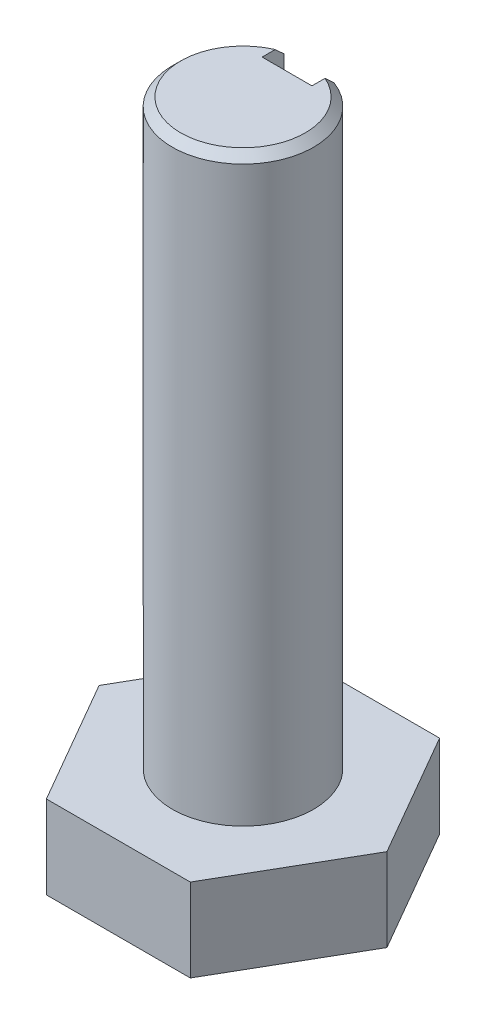
ISO-10303-21;
HEADER;
FILE_DESCRIPTION(('STEP AP214'),'2;1');
FILE_NAME('part.step','',(''),(''),'','','');
FILE_SCHEMA(('AUTOMOTIVE_DESIGN { 1 0 10303 214 1 1 1 1 }'));
ENDSEC;
DATA;
#1=APPLICATION_CONTEXT('core data for automotive mechanical design processes');
#2=APPLICATION_PROTOCOL_DEFINITION('international standard','automotive_design',2000,#1);
#3=PRODUCT_CONTEXT('',#1,'mechanical');
#4=PRODUCT('Part','Part','',(#3));
#5=PRODUCT_RELATED_PRODUCT_CATEGORY('part','',(#4));
#6=PRODUCT_DEFINITION_FORMATION('','',#4);
#7=PRODUCT_DEFINITION_CONTEXT('part definition',#1,'design');
#8=PRODUCT_DEFINITION('design','',#6,#7);
#9=PRODUCT_DEFINITION_SHAPE('','',#8);
#10=(LENGTH_UNIT() NAMED_UNIT(*) SI_UNIT(.MILLI.,.METRE.));
#11=(NAMED_UNIT(*) PLANE_ANGLE_UNIT() SI_UNIT($,.RADIAN.));
#12=(NAMED_UNIT(*) SI_UNIT($,.STERADIAN.) SOLID_ANGLE_UNIT());
#13=UNCERTAINTY_MEASURE_WITH_UNIT(LENGTH_MEASURE(1.E-05),#10,'distance_accuracy_value','');
#14=(GEOMETRIC_REPRESENTATION_CONTEXT(3) GLOBAL_UNCERTAINTY_ASSIGNED_CONTEXT((#13)) GLOBAL_UNIT_ASSIGNED_CONTEXT((#10,
#11,#12)) REPRESENTATION_CONTEXT('',''));
#15=CARTESIAN_POINT('',(0.,0.,0.));
#16=DIRECTION('',(0.,0.,1.));
#17=DIRECTION('',(1.,0.,0.));
#18=AXIS2_PLACEMENT_3D('',#15,#16,#17);
#19=CARTESIAN_POINT('',(17.3205080756888,10.,0.));
#20=DIRECTION('',(-0.866025403784438,0.,0.5));
#21=DIRECTION('',(0.5,0.,0.866025403784439));
#22=AXIS2_PLACEMENT_3D('',#19,#20,#21);
#23=PLANE('',#22);
#24=DIRECTION('',(-0.5,0.,-0.866025403784439));
#25=VECTOR('',#24,1.);
#26=CARTESIAN_POINT('',(17.3205080756888,0.,0.));
#27=LINE('',#26,#25);
#28=CARTESIAN_POINT('',(17.3205080756888,0.,0.));
#29=VERTEX_POINT('',#28);
#30=CARTESIAN_POINT('',(8.66025403784439,0.,-15.));
#31=VERTEX_POINT('',#30);
#32=EDGE_CURVE('E174',#29,#31,#27,.T.);
#33=ORIENTED_EDGE('',*,*,#32,.T.);
#34=DIRECTION('',(0.,-1.,0.));
#35=VECTOR('',#34,1.);
#36=CARTESIAN_POINT('',(8.66025403784439,10.,-15.));
#37=LINE('',#36,#35);
#38=CARTESIAN_POINT('',(8.66025403784439,10.,-15.));
#39=VERTEX_POINT('',#38);
#40=EDGE_CURVE('E177',#39,#31,#37,.T.);
#41=ORIENTED_EDGE('',*,*,#40,.F.);
#42=DIRECTION('',(-0.5,0.,-0.866025403784439));
#43=VECTOR('',#42,1.);
#44=CARTESIAN_POINT('',(17.3205080756888,10.,0.));
#45=LINE('',#44,#43);
#46=CARTESIAN_POINT('',(17.3205080756888,10.,0.));
#47=VERTEX_POINT('',#46);
#48=EDGE_CURVE('E178',#47,#39,#45,.T.);
#49=ORIENTED_EDGE('',*,*,#48,.F.);
#50=DIRECTION('',(0.,-1.,0.));
#51=VECTOR('',#50,1.);
#52=CARTESIAN_POINT('',(17.3205080756888,10.,0.));
#53=LINE('',#52,#51);
#54=EDGE_CURVE('E192',#47,#29,#53,.T.);
#55=ORIENTED_EDGE('',*,*,#54,.T.);
#56=EDGE_LOOP('',(#33,#41,#49,#55));
#57=FACE_BOUND('',#56,.T.);
#58=ADVANCED_FACE('F36',(#57),#23,.F.);
#59=CARTESIAN_POINT('',(8.66025403784439,10.,-15.));
#60=DIRECTION('',(0.,0.,1.));
#61=DIRECTION('',(1.,0.,0.));
#62=AXIS2_PLACEMENT_3D('',#59,#60,#61);
#63=PLANE('',#62);
#64=DIRECTION('',(-1.,0.,0.));
#65=VECTOR('',#64,1.);
#66=CARTESIAN_POINT('',(8.66025403784439,0.,-15.));
#67=LINE('',#66,#65);
#68=CARTESIAN_POINT('',(-8.66025403784438,0.,-15.));
#69=VERTEX_POINT('',#68);
#70=EDGE_CURVE('E195',#31,#69,#67,.T.);
#71=ORIENTED_EDGE('',*,*,#70,.T.);
#72=DIRECTION('',(0.,-1.,0.));
#73=VECTOR('',#72,1.);
#74=CARTESIAN_POINT('',(-8.66025403784438,10.,-15.));
#75=LINE('',#74,#73);
#76=CARTESIAN_POINT('',(-8.66025403784438,10.,-15.));
#77=VERTEX_POINT('',#76);
#78=EDGE_CURVE('E215',#77,#69,#75,.T.);
#79=ORIENTED_EDGE('',*,*,#78,.F.);
#80=DIRECTION('',(-1.,0.,0.));
#81=VECTOR('',#80,1.);
#82=CARTESIAN_POINT('',(8.66025403784439,10.,-15.));
#83=LINE('',#82,#81);
#84=EDGE_CURVE('E181',#39,#77,#83,.T.);
#85=ORIENTED_EDGE('',*,*,#84,.F.);
#86=ORIENTED_EDGE('',*,*,#40,.T.);
#87=EDGE_LOOP('',(#71,#79,#85,#86));
#88=FACE_BOUND('',#87,.T.);
#89=ADVANCED_FACE('F269',(#88),#63,.F.);
#90=CARTESIAN_POINT('',(-8.66025403784438,10.,-15.));
#91=DIRECTION('',(0.866025403784439,0.,0.5));
#92=DIRECTION('',(0.5,0.,-0.866025403784439));
#93=AXIS2_PLACEMENT_3D('',#90,#91,#92);
#94=PLANE('',#93);
#95=DIRECTION('',(-0.5,0.,0.866025403784439));
#96=VECTOR('',#95,1.);
#97=CARTESIAN_POINT('',(-8.66025403784438,0.,-15.));
#98=LINE('',#97,#96);
#99=CARTESIAN_POINT('',(-17.3205080756888,0.,0.));
#100=VERTEX_POINT('',#99);
#101=EDGE_CURVE('E197',#69,#100,#98,.T.);
#102=ORIENTED_EDGE('',*,*,#101,.T.);
#103=DIRECTION('',(0.,-1.,0.));
#104=VECTOR('',#103,1.);
#105=CARTESIAN_POINT('',(-17.3205080756888,10.,0.));
#106=LINE('',#105,#104);
#107=CARTESIAN_POINT('',(-17.3205080756888,10.,0.));
#108=VERTEX_POINT('',#107);
#109=EDGE_CURVE('E212',#108,#100,#106,.T.);
#110=ORIENTED_EDGE('',*,*,#109,.F.);
#111=DIRECTION('',(-0.5,0.,0.866025403784439));
#112=VECTOR('',#111,1.);
#113=CARTESIAN_POINT('',(-8.66025403784438,10.,-15.));
#114=LINE('',#113,#112);
#115=EDGE_CURVE('E184',#77,#108,#114,.T.);
#116=ORIENTED_EDGE('',*,*,#115,.F.);
#117=ORIENTED_EDGE('',*,*,#78,.T.);
#118=EDGE_LOOP('',(#102,#110,#116,#117));
#119=FACE_BOUND('',#118,.T.);
#120=ADVANCED_FACE('F274',(#119),#94,.F.);
#121=CARTESIAN_POINT('',(-17.3205080756888,10.,0.));
#122=DIRECTION('',(0.866025403784439,0.,-0.5));
#123=DIRECTION('',(-0.5,0.,-0.866025403784439));
#124=AXIS2_PLACEMENT_3D('',#121,#122,#123);
#125=PLANE('',#124);
#126=DIRECTION('',(0.5,0.,0.866025403784439));
#127=VECTOR('',#126,1.);
#128=CARTESIAN_POINT('',(-17.3205080756888,0.,0.));
#129=LINE('',#128,#127);
#130=CARTESIAN_POINT('',(-8.66025403784438,0.,15.));
#131=VERTEX_POINT('',#130);
#132=EDGE_CURVE('E199',#100,#131,#129,.T.);
#133=ORIENTED_EDGE('',*,*,#132,.T.);
#134=DIRECTION('',(0.,-1.,0.));
#135=VECTOR('',#134,1.);
#136=CARTESIAN_POINT('',(-8.66025403784438,10.,15.));
#137=LINE('',#136,#135);
#138=CARTESIAN_POINT('',(-8.66025403784438,10.,15.));
#139=VERTEX_POINT('',#138);
#140=EDGE_CURVE('E209',#139,#131,#137,.T.);
#141=ORIENTED_EDGE('',*,*,#140,.F.);
#142=DIRECTION('',(0.5,0.,0.866025403784439));
#143=VECTOR('',#142,1.);
#144=CARTESIAN_POINT('',(-17.3205080756888,10.,0.));
#145=LINE('',#144,#143);
#146=EDGE_CURVE('E186',#108,#139,#145,.T.);
#147=ORIENTED_EDGE('',*,*,#146,.F.);
#148=ORIENTED_EDGE('',*,*,#109,.T.);
#149=EDGE_LOOP('',(#133,#141,#147,#148));
#150=FACE_BOUND('',#149,.T.);
#151=ADVANCED_FACE('F299',(#150),#125,.F.);
#152=CARTESIAN_POINT('',(-8.66025403784438,10.,15.));
#153=DIRECTION('',(0.,0.,-1.));
#154=DIRECTION('',(-1.,0.,0.));
#155=AXIS2_PLACEMENT_3D('',#152,#153,#154);
#156=PLANE('',#155);
#157=DIRECTION('',(1.,0.,0.));
#158=VECTOR('',#157,1.);
#159=CARTESIAN_POINT('',(-8.66025403784438,0.,15.));
#160=LINE('',#159,#158);
#161=CARTESIAN_POINT('',(8.66025403784438,0.,15.));
#162=VERTEX_POINT('',#161);
#163=EDGE_CURVE('E201',#131,#162,#160,.T.);
#164=ORIENTED_EDGE('',*,*,#163,.T.);
#165=DIRECTION('',(0.,-1.,0.));
#166=VECTOR('',#165,1.);
#167=CARTESIAN_POINT('',(8.66025403784438,10.,15.));
#168=LINE('',#167,#166);
#169=CARTESIAN_POINT('',(8.66025403784438,10.,15.));
#170=VERTEX_POINT('',#169);
#171=EDGE_CURVE('E206',#170,#162,#168,.T.);
#172=ORIENTED_EDGE('',*,*,#171,.F.);
#173=DIRECTION('',(1.,0.,0.));
#174=VECTOR('',#173,1.);
#175=CARTESIAN_POINT('',(-8.66025403784438,10.,15.));
#176=LINE('',#175,#174);
#177=EDGE_CURVE('E188',#139,#170,#176,.T.);
#178=ORIENTED_EDGE('',*,*,#177,.F.);
#179=ORIENTED_EDGE('',*,*,#140,.T.);
#180=EDGE_LOOP('',(#164,#172,#178,#179));
#181=FACE_BOUND('',#180,.T.);
#182=ADVANCED_FACE('F296',(#181),#156,.F.);
#183=CARTESIAN_POINT('',(8.66025403784438,10.,15.));
#184=DIRECTION('',(-0.866025403784439,0.,-0.5));
#185=DIRECTION('',(-0.5,0.,0.866025403784439));
#186=AXIS2_PLACEMENT_3D('',#183,#184,#185);
#187=PLANE('',#186);
#188=DIRECTION('',(0.5,0.,-0.866025403784439));
#189=VECTOR('',#188,1.);
#190=CARTESIAN_POINT('',(8.66025403784438,0.,15.));
#191=LINE('',#190,#189);
#192=EDGE_CURVE('E182',#162,#29,#191,.T.);
#193=ORIENTED_EDGE('',*,*,#192,.T.);
#194=ORIENTED_EDGE('',*,*,#54,.F.);
#195=DIRECTION('',(0.5,0.,-0.866025403784439));
#196=VECTOR('',#195,1.);
#197=CARTESIAN_POINT('',(8.66025403784438,10.,15.));
#198=LINE('',#197,#196);
#199=EDGE_CURVE('E190',#170,#47,#198,.T.);
#200=ORIENTED_EDGE('',*,*,#199,.F.);
#201=ORIENTED_EDGE('',*,*,#171,.T.);
#202=EDGE_LOOP('',(#193,#194,#200,#201));
#203=FACE_BOUND('',#202,.T.);
#204=ADVANCED_FACE('F294',(#203),#187,.F.);
#205=CARTESIAN_POINT('',(0.,10.,0.));
#206=DIRECTION('',(0.,1.,0.));
#207=DIRECTION('',(0.,0.,1.));
#208=AXIS2_PLACEMENT_3D('',#205,#206,#207);
#209=PLANE('',#208);
#210=CARTESIAN_POINT('',(0.,10.,0.));
#211=DIRECTION('',(0.,1.,0.));
#212=DIRECTION('',(0.,0.,1.));
#213=AXIS2_PLACEMENT_3D('',#210,#211,#212);
#214=CIRCLE('',#213,8.5);
#215=CARTESIAN_POINT('',(0.,10.,8.5));
#216=VERTEX_POINT('',#215);
#217=EDGE_CURVE('E149',#216,#216,#214,.T.);
#218=ORIENTED_EDGE('',*,*,#217,.F.);
#219=EDGE_LOOP('',(#218));
#220=FACE_BOUND('',#219,.T.);
#221=ORIENTED_EDGE('',*,*,#48,.T.);
#222=ORIENTED_EDGE('',*,*,#84,.T.);
#223=ORIENTED_EDGE('',*,*,#115,.T.);
#224=ORIENTED_EDGE('',*,*,#146,.T.);
#225=ORIENTED_EDGE('',*,*,#177,.T.);
#226=ORIENTED_EDGE('',*,*,#199,.T.);
#227=EDGE_LOOP('',(#221,#222,#223,#224,#225,#226));
#228=FACE_BOUND('',#227,.T.);
#229=ADVANCED_FACE('F289',(#220,#228),#209,.T.);
#230=CARTESIAN_POINT('',(0.,0.,0.));
#231=DIRECTION('',(0.,1.,0.));
#232=DIRECTION('',(0.,0.,1.));
#233=AXIS2_PLACEMENT_3D('',#230,#231,#232);
#234=PLANE('',#233);
#235=ORIENTED_EDGE('',*,*,#32,.F.);
#236=ORIENTED_EDGE('',*,*,#192,.F.);
#237=ORIENTED_EDGE('',*,*,#163,.F.);
#238=ORIENTED_EDGE('',*,*,#132,.F.);
#239=ORIENTED_EDGE('',*,*,#101,.F.);
#240=ORIENTED_EDGE('',*,*,#70,.F.);
#241=EDGE_LOOP('',(#235,#236,#237,#238,#239,#240));
#242=FACE_BOUND('',#241,.T.);
#243=ADVANCED_FACE('F282',(#242),#234,.F.);
#244=CARTESIAN_POINT('',(0.,80.,0.));
#245=DIRECTION('',(0.,-1.,0.));
#246=DIRECTION('',(0.,0.,-1.));
#247=AXIS2_PLACEMENT_3D('',#244,#245,#246);
#248=CYLINDRICAL_SURFACE('',#247,8.5);
#249=DIRECTION('',(0.,-1.,0.));
#250=VECTOR('',#249,1.);
#251=CARTESIAN_POINT('',(3.,80.,-7.95298686029343));
#252=LINE('',#251,#250);
#253=CARTESIAN_POINT('',(3.,42.,-7.95298686029343));
#254=VERTEX_POINT('',#253);
#255=CARTESIAN_POINT('',(3.,79.,-7.95298686029343));
#256=VERTEX_POINT('',#255);
#257=EDGE_CURVE('E172',#254,#256,#252,.F.);
#258=ORIENTED_EDGE('',*,*,#257,.T.);
#259=CARTESIAN_POINT('',(0.,79.,0.));
#260=DIRECTION('',(0.,1.,0.));
#261=DIRECTION('',(0.,0.,1.));
#262=AXIS2_PLACEMENT_3D('',#259,#260,#261);
#263=CIRCLE('',#262,8.5);
#264=CARTESIAN_POINT('',(-3.,79.,-7.95298686029343));
#265=VERTEX_POINT('',#264);
#266=EDGE_CURVE('E51',#256,#265,#263,.F.);
#267=ORIENTED_EDGE('',*,*,#266,.T.);
#268=DIRECTION('',(0.,-1.,0.));
#269=VECTOR('',#268,1.);
#270=CARTESIAN_POINT('',(-3.,80.,-7.95298686029343));
#271=LINE('',#270,#269);
#272=CARTESIAN_POINT('',(-3.,42.,-7.95298686029343));
#273=VERTEX_POINT('',#272);
#274=EDGE_CURVE('E169',#265,#273,#271,.T.);
#275=ORIENTED_EDGE('',*,*,#274,.T.);
#276=CARTESIAN_POINT('',(-3.,42.,-7.95298686029343));
#277=CARTESIAN_POINT('',(-3.00000733574836,41.9458626856805,-7.95297977853846));
#278=CARTESIAN_POINT('',(-2.99780202224076,41.8917300363025,-7.95381586947181));
#279=CARTESIAN_POINT('',(-2.98902300132062,41.7838840274155,-7.95712144243168));
#280=CARTESIAN_POINT('',(-2.98245043058545,41.7301705624838,-7.95959049944111));
#281=CARTESIAN_POINT('',(-2.96502052957499,41.6237079001688,-7.96609909968158));
#282=CARTESIAN_POINT('',(-2.9541764096321,41.5709562495828,-7.97013380038491));
#283=CARTESIAN_POINT('',(-2.92831862235842,41.4666341043548,-7.97967034264205));
#284=CARTESIAN_POINT('',(-2.91330481893871,41.4150636483238,-7.98517223208132));
#285=CARTESIAN_POINT('',(-2.86221538635674,41.2627098986499,-8.00368981526015));
#286=CARTESIAN_POINT('',(-2.82006633742428,41.1641311470836,-8.0187273127157));
#287=CARTESIAN_POINT('',(-2.72098725700997,40.9755088141896,-8.05288508441416));
#288=CARTESIAN_POINT('',(-2.66404844296262,40.8854703478336,-8.07200778335898));
#289=CARTESIAN_POINT('',(-2.53465389008429,40.7127974013787,-8.11358764177404));
#290=CARTESIAN_POINT('',(-2.46170723589449,40.6305536181901,-8.13614110182109));
#291=CARTESIAN_POINT('',(-2.30352975920311,40.4792103419224,-8.18233053003901));
#292=CARTESIAN_POINT('',(-2.21829480081953,40.4101152925583,-8.20596686083771));
#293=CARTESIAN_POINT('',(-2.03341982967984,40.2838589518171,-8.25377007243724));
#294=CARTESIAN_POINT('',(-1.93329771352408,40.2273923395215,-8.2779113870958));
#295=CARTESIAN_POINT('',(-1.72447031249499,40.1323047612841,-8.32391782353751));
#296=CARTESIAN_POINT('',(-1.61577143188696,40.0936706247702,-8.34578461594308));
#297=CARTESIAN_POINT('',(-1.42238220343108,40.0432777425609,-8.38055777379095));
#298=CARTESIAN_POINT('',(-1.33896714487208,40.0271093069939,-8.39430273029633));
#299=CARTESIAN_POINT('',(-1.17044042267949,40.0054602997038,-8.41946762671194));
#300=CARTESIAN_POINT('',(-1.08532913624067,39.9999773780226,-8.43088807733261));
#301=CARTESIAN_POINT('',(-1.,40.,-8.44097150806707));
#302=B_SPLINE_CURVE_WITH_KNOTS('',3,(#276,#277,#278,#279,#280,#281,#282,#283,#284,#285,#286,
#287,#288,#289,#290,#291,#292,#293,#294,#295,#296,#297,#298,#299,#300,#301),.UNSPECIFIED.,.F.,
.F.,(4,2,2,2,2,2,2,2,2,2,2,2,4),(0.,0.162352695072816,0.324663150731165,0.486475531896211,
0.648293194867877,0.971467943245477,1.29483504208608,1.63001655137508,1.96531113742063,
2.31602049435369,2.66647041097054,2.92400760975601,3.18148816456831),.UNSPECIFIED.);
#303=CARTESIAN_POINT('',(-1.,40.,-8.44097150806707));
#304=VERTEX_POINT('',#303);
#305=EDGE_CURVE('E235',#273,#304,#302,.T.);
#306=ORIENTED_EDGE('',*,*,#305,.T.);
#307=CARTESIAN_POINT('',(0.,40.,0.));
#308=DIRECTION('',(0.,1.,0.));
#309=DIRECTION('',(0.,0.,1.));
#310=AXIS2_PLACEMENT_3D('',#307,#308,#309);
#311=CIRCLE('',#310,8.5);
#312=CARTESIAN_POINT('',(1.,40.,-8.44097150806707));
#313=VERTEX_POINT('',#312);
#314=EDGE_CURVE('E148',#313,#304,#311,.T.);
#315=ORIENTED_EDGE('',*,*,#314,.F.);
#316=CARTESIAN_POINT('',(1.,40.,-8.44097150806707));
#317=CARTESIAN_POINT('',(1.05669264551446,39.9999996445298,-8.43425841406365));
#318=CARTESIAN_POINT('',(1.11328630173407,40.0024118415846,-8.42697065741112));
#319=CARTESIAN_POINT('',(1.22590588489123,40.0119955224748,-8.41132438449623));
#320=CARTESIAN_POINT('',(1.28193195094283,40.019165809993,-8.4029661378112));
#321=CARTESIAN_POINT('',(1.4483141102318,40.0476599269977,-8.37645101354774));
#322=CARTESIAN_POINT('',(1.55731814215919,40.0759678744034,-8.35681258589082));
#323=CARTESIAN_POINT('',(1.76845187406156,40.1501304514407,-8.31469765665746));
#324=CARTESIAN_POINT('',(1.87058475783377,40.195976887716,-8.29222248358748));
#325=CARTESIAN_POINT('',(2.06560671398938,40.3038570324978,-8.24580632084102));
#326=CARTESIAN_POINT('',(2.15849164951929,40.3658979406803,-8.22186468284161));
#327=CARTESIAN_POINT('',(2.33492376635154,40.5063412376542,-8.17353783719734));
#328=CARTESIAN_POINT('',(2.41817226770314,40.5851206603448,-8.1491568959027));
#329=CARTESIAN_POINT('',(2.57028454405841,40.7560965574235,-8.10246759740526));
#330=CARTESIAN_POINT('',(2.63914623850604,40.8482949691396,-8.0801595402324));
#331=CARTESIAN_POINT('',(2.76022714261576,41.0435635101284,-8.03960370387732));
#332=CARTESIAN_POINT('',(2.81248383120941,41.1466084472577,-8.02134680940149));
#333=CARTESIAN_POINT('',(2.89862554784104,41.3608543600553,-7.99062463699542));
#334=CARTESIAN_POINT('',(2.93253507020362,41.4720442354183,-7.97815164048921));
#335=CARTESIAN_POINT('',(2.97098345998888,41.6534925669593,-7.96388652793264));
#336=CARTESIAN_POINT('',(2.98184687395993,41.7222939429475,-7.95981717409166));
#337=CARTESIAN_POINT('',(2.99635864210113,41.8607158123103,-7.95436074546546));
#338=CARTESIAN_POINT('',(3.00001127139474,41.9303357957027,-7.95297208136617));
#339=CARTESIAN_POINT('',(3.,42.,-7.95298686029343));
#340=B_SPLINE_CURVE_WITH_KNOTS('',3,(#316,#317,#318,#319,#320,#321,#322,#323,#324,#325,#326,
#327,#328,#329,#330,#331,#332,#333,#334,#335,#336,#337,#338,#339),.UNSPECIFIED.,.F.,.F.,(4,2,2,
2,2,2,2,2,2,2,2,4),(0.,0.171153341974663,0.342263667505589,0.683458670782784,1.02449447419377,
1.36568215298255,1.7155742088416,2.06551682956243,2.41466389484785,2.76334367506254,
2.97226695497708,3.18106633140331),.UNSPECIFIED.);
#341=EDGE_CURVE('E243',#313,#254,#340,.T.);
#342=ORIENTED_EDGE('',*,*,#341,.T.);
#343=EDGE_LOOP('',(#258,#267,#275,#306,#315,#342));
#344=FACE_BOUND('',#343,.T.);
#345=ORIENTED_EDGE('',*,*,#217,.T.);
#346=EDGE_LOOP('',(#345));
#347=FACE_BOUND('',#346,.T.);
#348=ADVANCED_FACE('F249',(#344,#347),#248,.T.);
#349=CARTESIAN_POINT('',(0.,80.,0.));
#350=DIRECTION('',(0.,1.,0.));
#351=DIRECTION('',(0.,0.,1.));
#352=AXIS2_PLACEMENT_3D('',#349,#350,#351);
#353=PLANE('',#352);
#354=DIRECTION('',(0.,0.,1.));
#355=VECTOR('',#354,1.);
#356=CARTESIAN_POINT('',(-3.,80.,0.));
#357=LINE('',#356,#355);
#358=CARTESIAN_POINT('',(-3.,80.,-6.87386354243375));
#359=VERTEX_POINT('',#358);
#360=CARTESIAN_POINT('',(-3.,80.,-5.3));
#361=VERTEX_POINT('',#360);
#362=EDGE_CURVE('E137',#359,#361,#357,.T.);
#363=ORIENTED_EDGE('',*,*,#362,.F.);
#364=CARTESIAN_POINT('',(0.,80.,0.));
#365=DIRECTION('',(0.,1.,0.));
#366=DIRECTION('',(0.,0.,1.));
#367=AXIS2_PLACEMENT_3D('',#364,#365,#366);
#368=CIRCLE('',#367,7.49999999999999);
#369=CARTESIAN_POINT('',(3.,80.,-6.87386354243375));
#370=VERTEX_POINT('',#369);
#371=EDGE_CURVE('E328',#359,#370,#368,.T.);
#372=ORIENTED_EDGE('',*,*,#371,.T.);
#373=DIRECTION('',(0.,0.,-1.));
#374=VECTOR('',#373,1.);
#375=CARTESIAN_POINT('',(3.,80.,-11.7));
#376=LINE('',#375,#374);
#377=CARTESIAN_POINT('',(3.,80.,-5.3));
#378=VERTEX_POINT('',#377);
#379=EDGE_CURVE('E163',#378,#370,#376,.T.);
#380=ORIENTED_EDGE('',*,*,#379,.F.);
#381=DIRECTION('',(1.,0.,0.));
#382=VECTOR('',#381,1.);
#383=CARTESIAN_POINT('',(-3.,80.,-5.3));
#384=LINE('',#383,#382);
#385=EDGE_CURVE('E156',#361,#378,#384,.T.);
#386=ORIENTED_EDGE('',*,*,#385,.F.);
#387=EDGE_LOOP('',(#363,#372,#380,#386));
#388=FACE_BOUND('',#387,.T.);
#389=ADVANCED_FACE('F162',(#388),#353,.T.);
#390=CARTESIAN_POINT('',(0.,40.,0.));
#391=DIRECTION('',(0.,1.,0.));
#392=DIRECTION('',(0.,0.,1.));
#393=AXIS2_PLACEMENT_3D('',#390,#391,#392);
#394=PLANE('',#393);
#395=ORIENTED_EDGE('',*,*,#314,.T.);
#396=DIRECTION('',(0.,0.,1.));
#397=VECTOR('',#396,1.);
#398=CARTESIAN_POINT('',(-1.,40.,0.));
#399=LINE('',#398,#397);
#400=CARTESIAN_POINT('',(-1.,40.,-5.3));
#401=VERTEX_POINT('',#400);
#402=EDGE_CURVE('E225',#304,#401,#399,.T.);
#403=ORIENTED_EDGE('',*,*,#402,.T.);
#404=DIRECTION('',(1.,0.,0.));
#405=VECTOR('',#404,1.);
#406=CARTESIAN_POINT('',(-3.,40.,-5.3));
#407=LINE('',#406,#405);
#408=CARTESIAN_POINT('',(1.,40.,-5.3));
#409=VERTEX_POINT('',#408);
#410=EDGE_CURVE('E160',#401,#409,#407,.T.);
#411=ORIENTED_EDGE('',*,*,#410,.T.);
#412=DIRECTION('',(0.,0.,-1.));
#413=VECTOR('',#412,1.);
#414=CARTESIAN_POINT('',(1.,40.,0.));
#415=LINE('',#414,#413);
#416=EDGE_CURVE('E222',#409,#313,#415,.T.);
#417=ORIENTED_EDGE('',*,*,#416,.T.);
#418=EDGE_LOOP('',(#395,#403,#411,#417));
#419=FACE_BOUND('',#418,.T.);
#420=ADVANCED_FACE('F325',(#419),#394,.T.);
#421=CARTESIAN_POINT('',(3.,40.,-11.7));
#422=DIRECTION('',(1.,0.,0.));
#423=DIRECTION('',(0.,0.,-1.));
#424=AXIS2_PLACEMENT_3D('',#421,#422,#423);
#425=PLANE('',#424);
#426=ORIENTED_EDGE('',*,*,#379,.T.);
#427=CARTESIAN_POINT('',(3.,80.,-6.87386354243375));
#428=CARTESIAN_POINT('',(3.,79.917160751016,-6.96424729856918));
#429=CARTESIAN_POINT('',(3.,79.8341807838232,-7.0545019360006));
#430=CARTESIAN_POINT('',(3.,79.6679662503138,-7.23477539184607));
#431=CARTESIAN_POINT('',(3.,79.5847316856765,-7.32479421180836));
#432=CARTESIAN_POINT('',(3.,79.418033799435,-7.50461953669633));
#433=CARTESIAN_POINT('',(3.,79.3345704780945,-7.59442604186656));
#434=CARTESIAN_POINT('',(3.,79.1674357942046,-7.77384637372186));
#435=CARTESIAN_POINT('',(3.,79.0837644302901,-7.86346019913552));
#436=CARTESIAN_POINT('',(3.,79.,-7.95298686029343));
#437=B_SPLINE_CURVE_WITH_KNOTS('',3,(#427,#428,#429,#430,#431,#432,#433,#434,#435,#436),
.UNSPECIFIED.,.F.,.F.,(4,2,2,2,4),(0.,0.367809539211348,0.735616657498952,1.10342335192157,
1.47123246594112),.UNSPECIFIED.);
#438=EDGE_CURVE('E65',#370,#256,#437,.T.);
#439=ORIENTED_EDGE('',*,*,#438,.T.);
#440=ORIENTED_EDGE('',*,*,#257,.F.);
#441=DIRECTION('',(0.,0.,-1.));
#442=VECTOR('',#441,1.);
#443=CARTESIAN_POINT('',(3.,42.,-11.7));
#444=LINE('',#443,#442);
#445=CARTESIAN_POINT('',(3.,42.,-5.3));
#446=VERTEX_POINT('',#445);
#447=EDGE_CURVE('E233',#254,#446,#444,.F.);
#448=ORIENTED_EDGE('',*,*,#447,.T.);
#449=DIRECTION('',(0.,1.,0.));
#450=VECTOR('',#449,1.);
#451=CARTESIAN_POINT('',(3.,40.,-5.3));
#452=LINE('',#451,#450);
#453=EDGE_CURVE('E159',#446,#378,#452,.T.);
#454=ORIENTED_EDGE('',*,*,#453,.T.);
#455=EDGE_LOOP('',(#426,#439,#440,#448,#454));
#456=FACE_BOUND('',#455,.T.);
#457=ADVANCED_FACE('F335',(#456),#425,.F.);
#458=CARTESIAN_POINT('',(-3.,40.,-11.7));
#459=DIRECTION('',(-1.,0.,0.));
#460=DIRECTION('',(0.,0.,1.));
#461=AXIS2_PLACEMENT_3D('',#458,#459,#460);
#462=PLANE('',#461);
#463=ORIENTED_EDGE('',*,*,#274,.F.);
#464=CARTESIAN_POINT('',(-3.,79.,-7.95298686029343));
#465=CARTESIAN_POINT('',(-3.,79.0837644302901,-7.86346019913551));
#466=CARTESIAN_POINT('',(-3.,79.1674357942046,-7.77384637372185));
#467=CARTESIAN_POINT('',(-3.,79.3345704780945,-7.59442604186655));
#468=CARTESIAN_POINT('',(-3.,79.418033799435,-7.50461953669633));
#469=CARTESIAN_POINT('',(-3.,79.5847316856765,-7.32479421180837));
#470=CARTESIAN_POINT('',(-3.,79.6679662503138,-7.23477539184608));
#471=CARTESIAN_POINT('',(-3.,79.8341807838232,-7.05450193600061));
#472=CARTESIAN_POINT('',(-3.,79.917160751016,-6.96424729856918));
#473=CARTESIAN_POINT('',(-3.,80.,-6.87386354243376));
#474=B_SPLINE_CURVE_WITH_KNOTS('',3,(#464,#465,#466,#467,#468,#469,#470,#471,#472,#473),
.UNSPECIFIED.,.F.,.F.,(4,2,2,2,4),(0.,0.36780911401955,0.735615808442165,1.10342292672975,
1.47123246594112),.UNSPECIFIED.);
#475=EDGE_CURVE('E11',#265,#359,#474,.T.);
#476=ORIENTED_EDGE('',*,*,#475,.T.);
#477=ORIENTED_EDGE('',*,*,#362,.T.);
#478=DIRECTION('',(0.,1.,0.));
#479=VECTOR('',#478,1.);
#480=CARTESIAN_POINT('',(-3.,40.,-5.3));
#481=LINE('',#480,#479);
#482=CARTESIAN_POINT('',(-3.,42.,-5.3));
#483=VERTEX_POINT('',#482);
#484=EDGE_CURVE('E141',#483,#361,#481,.T.);
#485=ORIENTED_EDGE('',*,*,#484,.F.);
#486=DIRECTION('',(0.,0.,1.));
#487=VECTOR('',#486,1.);
#488=CARTESIAN_POINT('',(-3.,42.,-11.7));
#489=LINE('',#488,#487);
#490=EDGE_CURVE('E231',#483,#273,#489,.F.);
#491=ORIENTED_EDGE('',*,*,#490,.T.);
#492=EDGE_LOOP('',(#463,#476,#477,#485,#491));
#493=FACE_BOUND('',#492,.T.);
#494=ADVANCED_FACE('F139',(#493),#462,.F.);
#495=CARTESIAN_POINT('',(-3.,40.,-5.3));
#496=DIRECTION('',(0.,0.,1.));
#497=DIRECTION('',(1.,0.,0.));
#498=AXIS2_PLACEMENT_3D('',#495,#496,#497);
#499=PLANE('',#498);
#500=ORIENTED_EDGE('',*,*,#410,.F.);
#501=CARTESIAN_POINT('',(-1.,42.,-5.3));
#502=DIRECTION('',(0.,0.,1.));
#503=DIRECTION('',(1.,0.,0.));
#504=AXIS2_PLACEMENT_3D('',#501,#502,#503);
#505=CIRCLE('',#504,2.);
#506=EDGE_CURVE('E158',#401,#483,#505,.F.);
#507=ORIENTED_EDGE('',*,*,#506,.T.);
#508=ORIENTED_EDGE('',*,*,#484,.T.);
#509=ORIENTED_EDGE('',*,*,#385,.T.);
#510=ORIENTED_EDGE('',*,*,#453,.F.);
#511=CARTESIAN_POINT('',(1.,42.,-5.3));
#512=DIRECTION('',(0.,0.,1.));
#513=DIRECTION('',(1.,0.,0.));
#514=AXIS2_PLACEMENT_3D('',#511,#512,#513);
#515=CIRCLE('',#514,2.);
#516=EDGE_CURVE('E228',#446,#409,#515,.F.);
#517=ORIENTED_EDGE('',*,*,#516,.T.);
#518=EDGE_LOOP('',(#500,#507,#508,#509,#510,#517));
#519=FACE_BOUND('',#518,.T.);
#520=ADVANCED_FACE('F154',(#519),#499,.F.);
#521=CARTESIAN_POINT('',(-1.,42.,0.));
#522=DIRECTION('',(0.,0.,1.));
#523=DIRECTION('',(1.,0.,0.));
#524=AXIS2_PLACEMENT_3D('',#521,#522,#523);
#525=CYLINDRICAL_SURFACE('',#524,2.);
#526=ORIENTED_EDGE('',*,*,#305,.F.);
#527=ORIENTED_EDGE('',*,*,#490,.F.);
#528=ORIENTED_EDGE('',*,*,#506,.F.);
#529=ORIENTED_EDGE('',*,*,#402,.F.);
#530=EDGE_LOOP('',(#526,#527,#528,#529));
#531=FACE_BOUND('',#530,.T.);
#532=ADVANCED_FACE('F253',(#531),#525,.F.);
#533=CARTESIAN_POINT('',(1.,42.,0.));
#534=DIRECTION('',(0.,0.,-1.));
#535=DIRECTION('',(-1.,0.,0.));
#536=AXIS2_PLACEMENT_3D('',#533,#534,#535);
#537=CYLINDRICAL_SURFACE('',#536,2.);
#538=ORIENTED_EDGE('',*,*,#516,.F.);
#539=ORIENTED_EDGE('',*,*,#447,.F.);
#540=ORIENTED_EDGE('',*,*,#341,.F.);
#541=ORIENTED_EDGE('',*,*,#416,.F.);
#542=EDGE_LOOP('',(#538,#539,#540,#541));
#543=FACE_BOUND('',#542,.T.);
#544=ADVANCED_FACE('F257',(#543),#537,.F.);
#545=CARTESIAN_POINT('',(0.,80.,0.));
#546=DIRECTION('',(0.,-1.,0.));
#547=DIRECTION('',(0.,0.,-1.));
#548=AXIS2_PLACEMENT_3D('',#545,#546,#547);
#549=CONICAL_SURFACE('',#548,7.49999999999999,0.785398163397445);
#550=ORIENTED_EDGE('',*,*,#475,.F.);
#551=ORIENTED_EDGE('',*,*,#266,.F.);
#552=ORIENTED_EDGE('',*,*,#438,.F.);
#553=ORIENTED_EDGE('',*,*,#371,.F.);
#554=EDGE_LOOP('',(#550,#551,#552,#553));
#555=FACE_BOUND('',#554,.T.);
#556=ADVANCED_FACE('F39',(#555),#549,.T.);
#557=CLOSED_SHELL('',(#58,#89,#120,#151,#182,#204,#229,#243,#348,#389,#420,#457,#494,#520,#532,
#544,#556));
#558=MANIFOLD_SOLID_BREP('B2',#557);
#559=ADVANCED_BREP_SHAPE_REPRESENTATION('',(#18,#558),#14);
#560=SHAPE_DEFINITION_REPRESENTATION(#9,#559);
ENDSEC;
END-ISO-10303-21;
